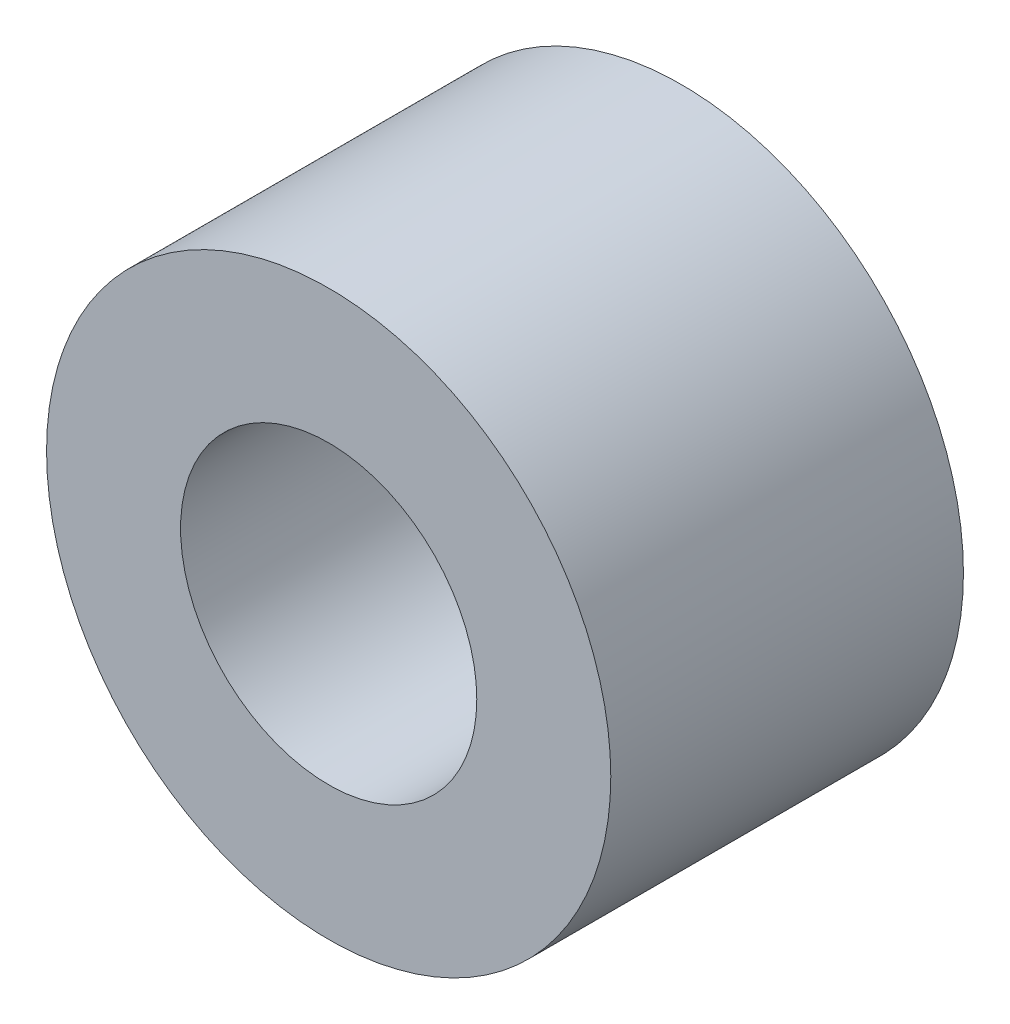
ISO-10303-21;
HEADER;
FILE_DESCRIPTION(('STEP AP214'),'2;1');
FILE_NAME('part.step','',(''),(''),'','','');
FILE_SCHEMA(('AUTOMOTIVE_DESIGN { 1 0 10303 214 1 1 1 1 }'));
ENDSEC;
DATA;
#1=APPLICATION_CONTEXT('core data for automotive mechanical design processes');
#2=APPLICATION_PROTOCOL_DEFINITION('international standard','automotive_design',2000,#1);
#3=PRODUCT_CONTEXT('',#1,'mechanical');
#4=PRODUCT('Part','Part','',(#3));
#5=PRODUCT_RELATED_PRODUCT_CATEGORY('part','',(#4));
#6=PRODUCT_DEFINITION_FORMATION('','',#4);
#7=PRODUCT_DEFINITION_CONTEXT('part definition',#1,'design');
#8=PRODUCT_DEFINITION('design','',#6,#7);
#9=PRODUCT_DEFINITION_SHAPE('','',#8);
#10=(LENGTH_UNIT() NAMED_UNIT(*) SI_UNIT(.MILLI.,.METRE.));
#11=(NAMED_UNIT(*) PLANE_ANGLE_UNIT() SI_UNIT($,.RADIAN.));
#12=(NAMED_UNIT(*) SI_UNIT($,.STERADIAN.) SOLID_ANGLE_UNIT());
#13=UNCERTAINTY_MEASURE_WITH_UNIT(LENGTH_MEASURE(1.E-05),#10,'distance_accuracy_value','');
#14=(GEOMETRIC_REPRESENTATION_CONTEXT(3) GLOBAL_UNCERTAINTY_ASSIGNED_CONTEXT((#13)) GLOBAL_UNIT_ASSIGNED_CONTEXT((#10,
#11,#12)) REPRESENTATION_CONTEXT('',''));
#15=CARTESIAN_POINT('',(0.,0.,0.));
#16=DIRECTION('',(0.,0.,1.));
#17=DIRECTION('',(1.,0.,0.));
#18=AXIS2_PLACEMENT_3D('',#15,#16,#17);
#19=CARTESIAN_POINT('',(0.,0.,5.));
#20=DIRECTION('',(0.,0.,1.));
#21=DIRECTION('',(1.,0.,0.));
#22=AXIS2_PLACEMENT_3D('',#19,#20,#21);
#23=PLANE('',#22);
#24=CARTESIAN_POINT('',(0.,0.,5.));
#25=DIRECTION('',(0.,0.,1.));
#26=DIRECTION('',(1.,0.,0.));
#27=AXIS2_PLACEMENT_3D('',#24,#25,#26);
#28=CIRCLE('',#27,4.);
#29=CARTESIAN_POINT('',(4.,0.,5.));
#30=VERTEX_POINT('',#29);
#31=EDGE_CURVE('E10',#30,#30,#28,.T.);
#32=ORIENTED_EDGE('',*,*,#31,.T.);
#33=EDGE_LOOP('',(#32));
#34=FACE_BOUND('',#33,.T.);
#35=CARTESIAN_POINT('',(0.,0.,5.));
#36=DIRECTION('',(0.,0.,1.));
#37=DIRECTION('',(1.,0.,0.));
#38=AXIS2_PLACEMENT_3D('',#35,#36,#37);
#39=CIRCLE('',#38,2.1);
#40=CARTESIAN_POINT('',(2.1,0.,5.));
#41=VERTEX_POINT('',#40);
#42=EDGE_CURVE('E42',#41,#41,#39,.T.);
#43=ORIENTED_EDGE('',*,*,#42,.F.);
#44=EDGE_LOOP('',(#43));
#45=FACE_BOUND('',#44,.T.);
#46=ADVANCED_FACE('F31',(#34,#45),#23,.T.);
#47=CARTESIAN_POINT('',(0.,0.,0.));
#48=DIRECTION('',(0.,0.,1.));
#49=DIRECTION('',(1.,0.,0.));
#50=AXIS2_PLACEMENT_3D('',#47,#48,#49);
#51=PLANE('',#50);
#52=CARTESIAN_POINT('',(0.,0.,0.));
#53=DIRECTION('',(0.,0.,1.));
#54=DIRECTION('',(1.,0.,0.));
#55=AXIS2_PLACEMENT_3D('',#52,#53,#54);
#56=CIRCLE('',#55,4.);
#57=CARTESIAN_POINT('',(4.,0.,0.));
#58=VERTEX_POINT('',#57);
#59=EDGE_CURVE('E35',#58,#58,#56,.T.);
#60=ORIENTED_EDGE('',*,*,#59,.F.);
#61=EDGE_LOOP('',(#60));
#62=FACE_BOUND('',#61,.T.);
#63=CARTESIAN_POINT('',(0.,0.,0.));
#64=DIRECTION('',(0.,0.,1.));
#65=DIRECTION('',(1.,0.,0.));
#66=AXIS2_PLACEMENT_3D('',#63,#64,#65);
#67=CIRCLE('',#66,2.1);
#68=CARTESIAN_POINT('',(2.1,0.,0.));
#69=VERTEX_POINT('',#68);
#70=EDGE_CURVE('E44',#69,#69,#67,.T.);
#71=ORIENTED_EDGE('',*,*,#70,.T.);
#72=EDGE_LOOP('',(#71));
#73=FACE_BOUND('',#72,.T.);
#74=ADVANCED_FACE('F54',(#62,#73),#51,.F.);
#75=CARTESIAN_POINT('',(0.,0.,5.));
#76=DIRECTION('',(0.,0.,-1.));
#77=DIRECTION('',(-1.,0.,0.));
#78=AXIS2_PLACEMENT_3D('',#75,#76,#77);
#79=CYLINDRICAL_SURFACE('',#78,4.);
#80=ORIENTED_EDGE('',*,*,#31,.F.);
#81=EDGE_LOOP('',(#80));
#82=FACE_BOUND('',#81,.T.);
#83=ORIENTED_EDGE('',*,*,#59,.T.);
#84=EDGE_LOOP('',(#83));
#85=FACE_BOUND('',#84,.T.);
#86=ADVANCED_FACE('F33',(#82,#85),#79,.T.);
#87=CARTESIAN_POINT('',(0.,0.,5.));
#88=DIRECTION('',(0.,0.,-1.));
#89=DIRECTION('',(-1.,0.,0.));
#90=AXIS2_PLACEMENT_3D('',#87,#88,#89);
#91=CYLINDRICAL_SURFACE('',#90,2.1);
#92=ORIENTED_EDGE('',*,*,#42,.T.);
#93=EDGE_LOOP('',(#92));
#94=FACE_BOUND('',#93,.T.);
#95=ORIENTED_EDGE('',*,*,#70,.F.);
#96=EDGE_LOOP('',(#95));
#97=FACE_BOUND('',#96,.T.);
#98=ADVANCED_FACE('F50',(#94,#97),#91,.F.);
#99=CLOSED_SHELL('',(#46,#74,#86,#98));
#100=MANIFOLD_SOLID_BREP('B2',#99);
#101=ADVANCED_BREP_SHAPE_REPRESENTATION('',(#18,#100),#14);
#102=SHAPE_DEFINITION_REPRESENTATION(#9,#101);
ENDSEC;
END-ISO-10303-21;
